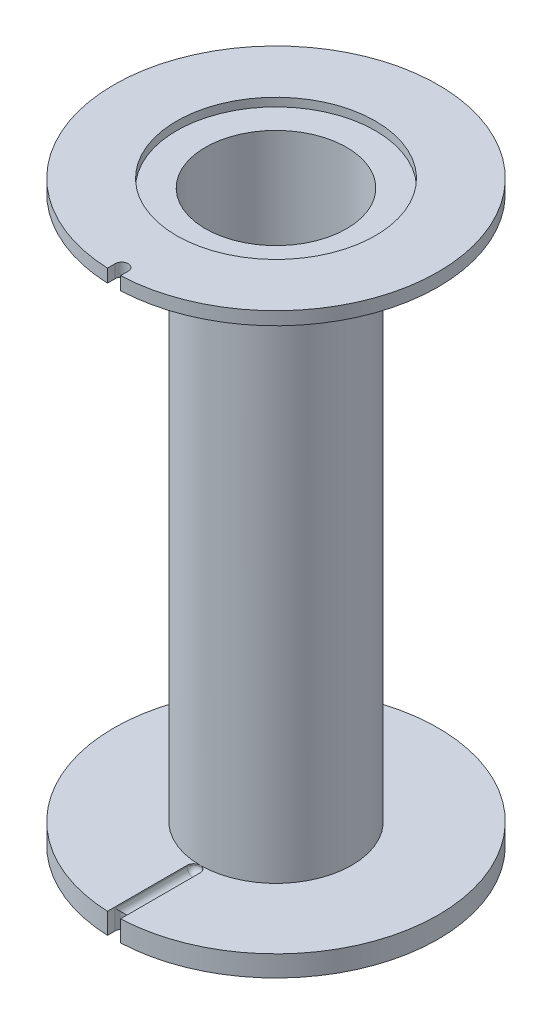
ISO-10303-21;
HEADER;
FILE_DESCRIPTION(('STEP AP214'),'2;1');
FILE_NAME('part.step','',(''),(''),'','','');
FILE_SCHEMA(('AUTOMOTIVE_DESIGN { 1 0 10303 214 1 1 1 1 }'));
ENDSEC;
DATA;
#1=APPLICATION_CONTEXT('core data for automotive mechanical design processes');
#2=APPLICATION_PROTOCOL_DEFINITION('international standard','automotive_design',2000,#1);
#3=PRODUCT_CONTEXT('',#1,'mechanical');
#4=PRODUCT('Part','Part','',(#3));
#5=PRODUCT_RELATED_PRODUCT_CATEGORY('part','',(#4));
#6=PRODUCT_DEFINITION_FORMATION('','',#4);
#7=PRODUCT_DEFINITION_CONTEXT('part definition',#1,'design');
#8=PRODUCT_DEFINITION('design','',#6,#7);
#9=PRODUCT_DEFINITION_SHAPE('','',#8);
#10=(LENGTH_UNIT() NAMED_UNIT(*) SI_UNIT(.MILLI.,.METRE.));
#11=(NAMED_UNIT(*) PLANE_ANGLE_UNIT() SI_UNIT($,.RADIAN.));
#12=(NAMED_UNIT(*) SI_UNIT($,.STERADIAN.) SOLID_ANGLE_UNIT());
#13=UNCERTAINTY_MEASURE_WITH_UNIT(LENGTH_MEASURE(1.E-05),#10,'distance_accuracy_value','');
#14=(GEOMETRIC_REPRESENTATION_CONTEXT(3) GLOBAL_UNCERTAINTY_ASSIGNED_CONTEXT((#13)) GLOBAL_UNIT_ASSIGNED_CONTEXT((#10,
#11,#12)) REPRESENTATION_CONTEXT('',''));
#15=CARTESIAN_POINT('',(0.,0.,0.));
#16=DIRECTION('',(0.,0.,1.));
#17=DIRECTION('',(1.,0.,0.));
#18=AXIS2_PLACEMENT_3D('',#15,#16,#17);
#19=CARTESIAN_POINT('',(-11.5159821298024,87.1751153655197,0.));
#20=DIRECTION('',(0.,-1.,0.));
#21=DIRECTION('',(1.,0.,0.));
#22=AXIS2_PLACEMENT_3D('',#19,#20,#21);
#23=CYLINDRICAL_SURFACE('',#22,13.4999999999999);
#24=CARTESIAN_POINT('',(-11.5159821298024,33.5251153655198,0.));
#25=DIRECTION('',(0.,-1.,0.));
#26=DIRECTION('',(1.,0.,0.));
#27=AXIS2_PLACEMENT_3D('',#24,#25,#26);
#28=CIRCLE('',#27,13.4999999999999);
#29=CARTESIAN_POINT('',(1.98401787019748,33.5251153655198,0.));
#30=VERTEX_POINT('',#29);
#31=EDGE_CURVE('E20',#30,#30,#28,.T.);
#32=ORIENTED_EDGE('',*,*,#31,.T.);
#33=EDGE_LOOP('',(#32));
#34=FACE_BOUND('',#33,.T.);
#35=CARTESIAN_POINT('',(-11.5159821298024,140.82511536552,0.));
#36=DIRECTION('',(0.,-1.,0.));
#37=DIRECTION('',(1.,0.,0.));
#38=AXIS2_PLACEMENT_3D('',#35,#36,#37);
#39=CIRCLE('',#38,13.4999999999999);
#40=CARTESIAN_POINT('',(1.98401787019747,140.82511536552,0.));
#41=VERTEX_POINT('',#40);
#42=EDGE_CURVE('E350',#41,#41,#39,.F.);
#43=ORIENTED_EDGE('',*,*,#42,.T.);
#44=EDGE_LOOP('',(#43));
#45=FACE_BOUND('',#44,.T.);
#46=ADVANCED_FACE('F17',(#34,#45),#23,.F.);
#47=CARTESIAN_POINT('',(-11.5159821298024,33.5251153655198,0.));
#48=DIRECTION('',(0.,1.,0.));
#49=DIRECTION('',(0.,0.,1.));
#50=AXIS2_PLACEMENT_3D('',#47,#48,#49);
#51=PLANE('',#50);
#52=ORIENTED_EDGE('',*,*,#31,.F.);
#53=EDGE_LOOP('',(#52));
#54=FACE_BOUND('',#53,.T.);
#55=CARTESIAN_POINT('',(-11.5159821298024,33.5251153655198,0.));
#56=DIRECTION('',(0.,1.,0.));
#57=DIRECTION('',(0.,0.,1.));
#58=AXIS2_PLACEMENT_3D('',#55,#56,#57);
#59=CIRCLE('',#58,19.);
#60=CARTESIAN_POINT('',(-11.5159821298024,33.5251153655198,19.));
#61=VERTEX_POINT('',#60);
#62=EDGE_CURVE('E347',#61,#61,#59,.F.);
#63=ORIENTED_EDGE('',*,*,#62,.T.);
#64=EDGE_LOOP('',(#63));
#65=FACE_BOUND('',#64,.T.);
#66=ADVANCED_FACE('F128',(#54,#65),#51,.F.);
#67=CARTESIAN_POINT('',(-11.5159821298024,140.82511536552,0.));
#68=DIRECTION('',(0.,-1.,0.));
#69=DIRECTION('',(0.,0.,-1.));
#70=AXIS2_PLACEMENT_3D('',#67,#68,#69);
#71=PLANE('',#70);
#72=ORIENTED_EDGE('',*,*,#42,.F.);
#73=EDGE_LOOP('',(#72));
#74=FACE_BOUND('',#73,.T.);
#75=CARTESIAN_POINT('',(-11.5159821298024,140.82511536552,0.));
#76=DIRECTION('',(0.,-1.,0.));
#77=DIRECTION('',(0.,0.,-1.));
#78=AXIS2_PLACEMENT_3D('',#75,#76,#77);
#79=CIRCLE('',#78,19.);
#80=CARTESIAN_POINT('',(-11.5159821298024,140.82511536552,-19.));
#81=VERTEX_POINT('',#80);
#82=EDGE_CURVE('E343',#81,#81,#79,.F.);
#83=ORIENTED_EDGE('',*,*,#82,.T.);
#84=EDGE_LOOP('',(#83));
#85=FACE_BOUND('',#84,.T.);
#86=ADVANCED_FACE('F125',(#74,#85),#71,.F.);
#87=CARTESIAN_POINT('',(-11.5159821298024,31.9251153655198,0.));
#88=DIRECTION('',(0.,1.,0.));
#89=DIRECTION('',(0.,0.,1.));
#90=AXIS2_PLACEMENT_3D('',#87,#88,#89);
#91=CYLINDRICAL_SURFACE('',#90,19.);
#92=CARTESIAN_POINT('',(-11.5159821298024,31.9251153655198,0.));
#93=DIRECTION('',(0.,1.,0.));
#94=DIRECTION('',(0.,0.,1.));
#95=AXIS2_PLACEMENT_3D('',#92,#93,#94);
#96=CIRCLE('',#95,19.);
#97=CARTESIAN_POINT('',(-11.5159821298024,31.9251153655198,19.));
#98=VERTEX_POINT('',#97);
#99=EDGE_CURVE('E291',#98,#98,#96,.T.);
#100=ORIENTED_EDGE('',*,*,#99,.F.);
#101=EDGE_LOOP('',(#100));
#102=FACE_BOUND('',#101,.T.);
#103=ORIENTED_EDGE('',*,*,#62,.F.);
#104=EDGE_LOOP('',(#103));
#105=FACE_BOUND('',#104,.T.);
#106=ADVANCED_FACE('F121',(#102,#105),#91,.F.);
#107=CARTESIAN_POINT('',(-11.5159821298024,142.42511536552,0.));
#108=DIRECTION('',(0.,-1.,0.));
#109=DIRECTION('',(0.,0.,-1.));
#110=AXIS2_PLACEMENT_3D('',#107,#108,#109);
#111=CYLINDRICAL_SURFACE('',#110,19.);
#112=CARTESIAN_POINT('',(-11.5159821298024,142.42511536552,0.));
#113=DIRECTION('',(0.,-1.,0.));
#114=DIRECTION('',(0.,0.,-1.));
#115=AXIS2_PLACEMENT_3D('',#112,#113,#114);
#116=CIRCLE('',#115,19.);
#117=CARTESIAN_POINT('',(-11.5159821298024,142.42511536552,-19.));
#118=VERTEX_POINT('',#117);
#119=EDGE_CURVE('E331',#118,#118,#116,.T.);
#120=ORIENTED_EDGE('',*,*,#119,.F.);
#121=EDGE_LOOP('',(#120));
#122=FACE_BOUND('',#121,.T.);
#123=ORIENTED_EDGE('',*,*,#82,.F.);
#124=EDGE_LOOP('',(#123));
#125=FACE_BOUND('',#124,.T.);
#126=ADVANCED_FACE('F117',(#122,#125),#111,.F.);
#127=CARTESIAN_POINT('',(-11.5159821298024,35.6751153655198,15.75));
#128=DIRECTION('',(-0.707106781186548,0.,0.707106781186548));
#129=DIRECTION('',(0.408248290463863,-0.816496580927726,0.408248290463863));
#130=AXIS2_PLACEMENT_3D('',#127,#128,#129);
#131=SPHERICAL_SURFACE('',#130,1.25);
#132=CARTESIAN_POINT('',(-11.5159821298024,35.6751153655198,15.75));
#133=DIRECTION('',(0.,-1.,0.));
#134=DIRECTION('',(0.,0.,-1.));
#135=AXIS2_PLACEMENT_3D('',#132,#133,#134);
#136=CIRCLE('',#135,1.25);
#137=CARTESIAN_POINT('',(-10.6320986533193,35.6751153655198,14.8661165235168));
#138=VERTEX_POINT('',#137);
#139=CARTESIAN_POINT('',(-12.7659821298024,35.6751153655198,15.75));
#140=VERTEX_POINT('',#139);
#141=EDGE_CURVE('E328',#138,#140,#136,.F.);
#142=ORIENTED_EDGE('',*,*,#141,.T.);
#143=CARTESIAN_POINT('',(-11.5159821298024,35.6751153655198,15.75));
#144=DIRECTION('',(0.,0.,-1.));
#145=DIRECTION('',(-1.,0.,0.));
#146=AXIS2_PLACEMENT_3D('',#143,#144,#145);
#147=CIRCLE('',#146,1.25);
#148=CARTESIAN_POINT('',(-10.2659821298025,35.675115365518,15.75));
#149=VERTEX_POINT('',#148);
#150=EDGE_CURVE('E93',#140,#149,#147,.F.);
#151=ORIENTED_EDGE('',*,*,#150,.T.);
#152=CARTESIAN_POINT('',(-11.5159821298025,35.6751153655198,15.75));
#153=DIRECTION('',(2.80128698015858E-12,1.,2.80131473573419E-12));
#154=DIRECTION('',(-0.707106781186547,0.,0.707106781186547));
#155=AXIS2_PLACEMENT_3D('',#152,#153,#154);
#156=CIRCLE('',#155,1.25);
#157=EDGE_CURVE('E39',#138,#149,#156,.F.);
#158=ORIENTED_EDGE('',*,*,#157,.F.);
#159=EDGE_LOOP('',(#142,#151,#158));
#160=FACE_BOUND('',#159,.T.);
#161=ADVANCED_FACE('F113',(#160),#131,.F.);
#162=CARTESIAN_POINT('',(-11.5159821298024,31.9251153655198,29.5));
#163=DIRECTION('',(0.,1.,0.));
#164=DIRECTION('',(-1.,0.,0.));
#165=AXIS2_PLACEMENT_3D('',#162,#163,#164);
#166=CYLINDRICAL_SURFACE('',#165,1.25);
#167=DIRECTION('',(0.,1.,0.));
#168=VECTOR('',#167,1.);
#169=CARTESIAN_POINT('',(-12.7659821298024,37.1873402785639,29.5));
#170=LINE('',#169,#168);
#171=CARTESIAN_POINT('',(-12.7659821298024,35.6751153655198,29.5));
#172=VERTEX_POINT('',#171);
#173=CARTESIAN_POINT('',(-12.7659821298024,31.9251153655198,29.5));
#174=VERTEX_POINT('',#173);
#175=EDGE_CURVE('E304',#172,#174,#170,.F.);
#176=ORIENTED_EDGE('',*,*,#175,.T.);
#177=CARTESIAN_POINT('',(-11.5159821298024,31.9251153655198,29.5));
#178=DIRECTION('',(0.,1.,0.));
#179=DIRECTION('',(-1.,0.,0.));
#180=AXIS2_PLACEMENT_3D('',#177,#178,#179);
#181=CIRCLE('',#180,1.25);
#182=CARTESIAN_POINT('',(-10.2659821298025,31.9251153655198,29.5));
#183=VERTEX_POINT('',#182);
#184=EDGE_CURVE('E76',#183,#174,#181,.T.);
#185=ORIENTED_EDGE('',*,*,#184,.F.);
#186=DIRECTION('',(0.,1.,0.));
#187=VECTOR('',#186,1.);
#188=CARTESIAN_POINT('',(-10.2659821298025,35.6751153655198,29.5));
#189=LINE('',#188,#187);
#190=CARTESIAN_POINT('',(-10.2659821298025,35.6751153655198,29.5));
#191=VERTEX_POINT('',#190);
#192=EDGE_CURVE('E70',#183,#191,#189,.T.);
#193=ORIENTED_EDGE('',*,*,#192,.T.);
#194=CARTESIAN_POINT('',(-11.5159821298024,35.6751153655198,29.5));
#195=DIRECTION('',(0.,0.707106781186547,-0.707106781186547));
#196=DIRECTION('',(0.,0.707106781186547,0.707106781186547));
#197=AXIS2_PLACEMENT_3D('',#194,#195,#196);
#198=ELLIPSE('',#197,1.76776695296637,1.25);
#199=EDGE_CURVE('E73',#191,#172,#198,.T.);
#200=ORIENTED_EDGE('',*,*,#199,.T.);
#201=EDGE_LOOP('',(#176,#185,#193,#200));
#202=FACE_BOUND('',#201,.T.);
#203=ADVANCED_FACE('F72',(#202),#166,.F.);
#204=CARTESIAN_POINT('',(-11.5159821298024,35.6751153655198,31.));
#205=DIRECTION('',(0.,0.,-1.));
#206=DIRECTION('',(-1.,0.,0.));
#207=AXIS2_PLACEMENT_3D('',#204,#205,#206);
#208=CYLINDRICAL_SURFACE('',#207,1.25);
#209=DIRECTION('',(0.,0.,1.));
#210=VECTOR('',#209,1.);
#211=CARTESIAN_POINT('',(-12.7659821298024,35.6751153655198,31.));
#212=LINE('',#211,#210);
#213=EDGE_CURVE('E90',#140,#172,#212,.T.);
#214=ORIENTED_EDGE('',*,*,#213,.T.);
#215=ORIENTED_EDGE('',*,*,#199,.F.);
#216=DIRECTION('',(0.,0.,-1.));
#217=VECTOR('',#216,1.);
#218=CARTESIAN_POINT('',(-10.2659821298025,35.6751153655198,31.));
#219=LINE('',#218,#217);
#220=EDGE_CURVE('E82',#191,#149,#219,.T.);
#221=ORIENTED_EDGE('',*,*,#220,.T.);
#222=ORIENTED_EDGE('',*,*,#150,.F.);
#223=EDGE_LOOP('',(#214,#215,#221,#222));
#224=FACE_BOUND('',#223,.T.);
#225=ADVANCED_FACE('F87',(#224),#208,.F.);
#226=CARTESIAN_POINT('',(10.7340178701975,31.9251153655198,0.));
#227=DIRECTION('',(0.,-1.,0.));
#228=DIRECTION('',(0.,0.,-1.));
#229=AXIS2_PLACEMENT_3D('',#226,#227,#228);
#230=PLANE('',#229);
#231=ORIENTED_EDGE('',*,*,#99,.T.);
#232=EDGE_LOOP('',(#231));
#233=FACE_BOUND('',#232,.T.);
#234=DIRECTION('',(0.,0.,1.));
#235=VECTOR('',#234,1.);
#236=CARTESIAN_POINT('',(-12.7659821298024,31.9251153655198,31.));
#237=LINE('',#236,#235);
#238=CARTESIAN_POINT('',(-12.7659821298024,31.9251153655198,30.9747881348686));
#239=VERTEX_POINT('',#238);
#240=EDGE_CURVE('E295',#174,#239,#237,.T.);
#241=ORIENTED_EDGE('',*,*,#240,.T.);
#242=CARTESIAN_POINT('',(-11.5159821298024,31.9251153655198,0.));
#243=DIRECTION('',(0.,-1.,0.));
#244=DIRECTION('',(1.,0.,0.));
#245=AXIS2_PLACEMENT_3D('',#242,#243,#244);
#246=CIRCLE('',#245,31.);
#247=CARTESIAN_POINT('',(-10.2659821298025,31.9251153655198,30.9747881348686));
#248=VERTEX_POINT('',#247);
#249=EDGE_CURVE('E298',#248,#239,#246,.F.);
#250=ORIENTED_EDGE('',*,*,#249,.F.);
#251=DIRECTION('',(0.,0.,-1.));
#252=VECTOR('',#251,1.);
#253=CARTESIAN_POINT('',(-10.2659821298025,31.9251153655198,31.));
#254=LINE('',#253,#252);
#255=EDGE_CURVE('E83',#248,#183,#254,.T.);
#256=ORIENTED_EDGE('',*,*,#255,.T.);
#257=ORIENTED_EDGE('',*,*,#184,.T.);
#258=EDGE_LOOP('',(#241,#250,#256,#257));
#259=FACE_BOUND('',#258,.T.);
#260=ADVANCED_FACE('F186',(#233,#259),#230,.T.);
#261=CARTESIAN_POINT('',(-10.2659821298024,31.9251153655198,29.5));
#262=DIRECTION('',(1.,0.,0.));
#263=DIRECTION('',(0.,0.,-1.));
#264=AXIS2_PLACEMENT_3D('',#261,#262,#263);
#265=PLANE('',#264);
#266=DIRECTION('',(0.,1.,0.));
#267=VECTOR('',#266,1.);
#268=CARTESIAN_POINT('',(-10.2659821298024,31.9251153655198,29.5));
#269=LINE('',#268,#267);
#270=CARTESIAN_POINT('',(-10.2659821298024,142.42511536552,29.5));
#271=VERTEX_POINT('',#270);
#272=CARTESIAN_POINT('',(-10.2659821298024,139.92511536552,29.5));
#273=VERTEX_POINT('',#272);
#274=EDGE_CURVE('E315',#271,#273,#269,.F.);
#275=ORIENTED_EDGE('',*,*,#274,.T.);
#276=DIRECTION('',(0.,0.,-1.));
#277=VECTOR('',#276,1.);
#278=CARTESIAN_POINT('',(-10.2659821298024,139.92511536552,29.5));
#279=LINE('',#278,#277);
#280=CARTESIAN_POINT('',(-10.2659821298024,139.92511536552,30.9747881348686));
#281=VERTEX_POINT('',#280);
#282=EDGE_CURVE('E338',#281,#273,#279,.T.);
#283=ORIENTED_EDGE('',*,*,#282,.F.);
#284=DIRECTION('',(0.,-1.,0.));
#285=VECTOR('',#284,1.);
#286=CARTESIAN_POINT('',(-10.2659821298024,141.17511536552,30.9747881348686));
#287=LINE('',#286,#285);
#288=CARTESIAN_POINT('',(-10.2659821298024,142.42511536552,30.9747881348686));
#289=VERTEX_POINT('',#288);
#290=EDGE_CURVE('E422',#289,#281,#287,.T.);
#291=ORIENTED_EDGE('',*,*,#290,.F.);
#292=DIRECTION('',(0.,0.,1.));
#293=VECTOR('',#292,1.);
#294=CARTESIAN_POINT('',(-10.2659821298024,142.42511536552,0.));
#295=LINE('',#294,#293);
#296=EDGE_CURVE('E435',#271,#289,#295,.T.);
#297=ORIENTED_EDGE('',*,*,#296,.F.);
#298=EDGE_LOOP('',(#275,#283,#291,#297));
#299=FACE_BOUND('',#298,.T.);
#300=ADVANCED_FACE('F182',(#299),#265,.F.);
#301=CARTESIAN_POINT('',(-12.7659821298024,31.9251153655198,32.7463376433633));
#302=DIRECTION('',(-1.,0.,0.));
#303=DIRECTION('',(0.,0.,1.));
#304=AXIS2_PLACEMENT_3D('',#301,#302,#303);
#305=PLANE('',#304);
#306=DIRECTION('',(0.,-1.,0.));
#307=VECTOR('',#306,1.);
#308=CARTESIAN_POINT('',(-12.7659821298024,141.17511536552,30.9747881348686));
#309=LINE('',#308,#307);
#310=CARTESIAN_POINT('',(-12.7659821298024,139.92511536552,30.9747881348686));
#311=VERTEX_POINT('',#310);
#312=CARTESIAN_POINT('',(-12.7659821298024,142.42511536552,30.9747881348686));
#313=VERTEX_POINT('',#312);
#314=EDGE_CURVE('E375',#311,#313,#309,.F.);
#315=ORIENTED_EDGE('',*,*,#314,.F.);
#316=DIRECTION('',(0.,0.,1.));
#317=VECTOR('',#316,1.);
#318=CARTESIAN_POINT('',(-12.7659821298024,139.92511536552,32.7463376433633));
#319=LINE('',#318,#317);
#320=CARTESIAN_POINT('',(-12.7659821298024,139.92511536552,29.5));
#321=VERTEX_POINT('',#320);
#322=EDGE_CURVE('E427',#321,#311,#319,.T.);
#323=ORIENTED_EDGE('',*,*,#322,.F.);
#324=DIRECTION('',(0.,1.,0.));
#325=VECTOR('',#324,1.);
#326=CARTESIAN_POINT('',(-12.7659821298024,31.9251153655198,29.5));
#327=LINE('',#326,#325);
#328=CARTESIAN_POINT('',(-12.7659821298024,142.42511536552,29.5));
#329=VERTEX_POINT('',#328);
#330=EDGE_CURVE('E441',#321,#329,#327,.T.);
#331=ORIENTED_EDGE('',*,*,#330,.T.);
#332=DIRECTION('',(0.,0.,1.));
#333=VECTOR('',#332,1.);
#334=CARTESIAN_POINT('',(-12.7659821298024,142.42511536552,0.));
#335=LINE('',#334,#333);
#336=EDGE_CURVE('E335',#313,#329,#335,.F.);
#337=ORIENTED_EDGE('',*,*,#336,.F.);
#338=EDGE_LOOP('',(#315,#323,#331,#337));
#339=FACE_BOUND('',#338,.T.);
#340=ADVANCED_FACE('F178',(#339),#305,.F.);
#341=CARTESIAN_POINT('',(10.7340178701975,142.42511536552,0.));
#342=DIRECTION('',(0.,1.,0.));
#343=DIRECTION('',(0.,0.,1.));
#344=AXIS2_PLACEMENT_3D('',#341,#342,#343);
#345=PLANE('',#344);
#346=ORIENTED_EDGE('',*,*,#119,.T.);
#347=EDGE_LOOP('',(#346));
#348=FACE_BOUND('',#347,.T.);
#349=ORIENTED_EDGE('',*,*,#336,.T.);
#350=CARTESIAN_POINT('',(-11.5159821298024,142.42511536552,29.5));
#351=DIRECTION('',(0.,1.,0.));
#352=DIRECTION('',(-1.,0.,0.));
#353=AXIS2_PLACEMENT_3D('',#350,#351,#352);
#354=CIRCLE('',#353,1.25);
#355=EDGE_CURVE('E326',#329,#271,#354,.F.);
#356=ORIENTED_EDGE('',*,*,#355,.T.);
#357=ORIENTED_EDGE('',*,*,#296,.T.);
#358=CARTESIAN_POINT('',(-11.5159821298024,142.42511536552,0.));
#359=DIRECTION('',(0.,-1.,0.));
#360=DIRECTION('',(1.,0.,0.));
#361=AXIS2_PLACEMENT_3D('',#358,#359,#360);
#362=CIRCLE('',#361,31.);
#363=EDGE_CURVE('E369',#313,#289,#362,.T.);
#364=ORIENTED_EDGE('',*,*,#363,.F.);
#365=EDGE_LOOP('',(#349,#356,#357,#364));
#366=FACE_BOUND('',#365,.T.);
#367=ADVANCED_FACE('F174',(#348,#366),#345,.T.);
#368=CARTESIAN_POINT('',(-12.7659821298024,37.1873402785639,31.));
#369=DIRECTION('',(-1.,0.,0.));
#370=DIRECTION('',(0.,0.,1.));
#371=AXIS2_PLACEMENT_3D('',#368,#369,#370);
#372=PLANE('',#371);
#373=DIRECTION('',(0.,0.,1.));
#374=VECTOR('',#373,1.);
#375=CARTESIAN_POINT('',(-12.7659821298024,35.9251153655198,0.));
#376=LINE('',#375,#374);
#377=CARTESIAN_POINT('',(-12.7659821298024,35.9251153655198,30.9747881348686));
#378=VERTEX_POINT('',#377);
#379=CARTESIAN_POINT('',(-12.7659821298024,35.9251153655198,15.75));
#380=VERTEX_POINT('',#379);
#381=EDGE_CURVE('E311',#378,#380,#376,.F.);
#382=ORIENTED_EDGE('',*,*,#381,.F.);
#383=DIRECTION('',(0.,-1.,0.));
#384=VECTOR('',#383,1.);
#385=CARTESIAN_POINT('',(-12.7659821298024,33.9251153655198,30.9747881348686));
#386=LINE('',#385,#384);
#387=EDGE_CURVE('E307',#239,#378,#386,.F.);
#388=ORIENTED_EDGE('',*,*,#387,.F.);
#389=ORIENTED_EDGE('',*,*,#240,.F.);
#390=ORIENTED_EDGE('',*,*,#175,.F.);
#391=ORIENTED_EDGE('',*,*,#213,.F.);
#392=DIRECTION('',(0.,-1.,0.));
#393=VECTOR('',#392,1.);
#394=CARTESIAN_POINT('',(-12.7659821298024,36.9012562457839,15.75));
#395=LINE('',#394,#393);
#396=EDGE_CURVE('E303',#140,#380,#395,.F.);
#397=ORIENTED_EDGE('',*,*,#396,.T.);
#398=EDGE_LOOP('',(#382,#388,#389,#390,#391,#397));
#399=FACE_BOUND('',#398,.T.);
#400=ADVANCED_FACE('F170',(#399),#372,.F.);
#401=CARTESIAN_POINT('',(-11.5159821298024,36.9012562457839,15.75));
#402=DIRECTION('',(0.,-1.,0.));
#403=DIRECTION('',(0.,0.,-1.));
#404=AXIS2_PLACEMENT_3D('',#401,#402,#403);
#405=CYLINDRICAL_SURFACE('',#404,1.25);
#406=DIRECTION('',(0.,1.,0.));
#407=VECTOR('',#406,1.);
#408=CARTESIAN_POINT('',(-10.2659821298025,35.6751153655198,15.75));
#409=LINE('',#408,#407);
#410=CARTESIAN_POINT('',(-10.2659821298025,35.9251153655198,15.75));
#411=VERTEX_POINT('',#410);
#412=EDGE_CURVE('E98',#149,#411,#409,.T.);
#413=ORIENTED_EDGE('',*,*,#412,.T.);
#414=CARTESIAN_POINT('',(-11.5159821298024,35.9251153655198,15.75));
#415=DIRECTION('',(0.,-1.,0.));
#416=DIRECTION('',(0.,0.,-1.));
#417=AXIS2_PLACEMENT_3D('',#414,#415,#416);
#418=CIRCLE('',#417,1.25);
#419=EDGE_CURVE('E360',#380,#411,#418,.T.);
#420=ORIENTED_EDGE('',*,*,#419,.F.);
#421=ORIENTED_EDGE('',*,*,#396,.F.);
#422=ORIENTED_EDGE('',*,*,#141,.F.);
#423=ORIENTED_EDGE('',*,*,#157,.T.);
#424=EDGE_LOOP('',(#413,#420,#421,#422,#423));
#425=FACE_BOUND('',#424,.T.);
#426=ADVANCED_FACE('F167',(#425),#405,.F.);
#427=CARTESIAN_POINT('',(-10.2659821298025,35.6751153655198,31.));
#428=DIRECTION('',(1.,0.,0.));
#429=DIRECTION('',(0.,0.,-1.));
#430=AXIS2_PLACEMENT_3D('',#427,#428,#429);
#431=PLANE('',#430);
#432=ORIENTED_EDGE('',*,*,#220,.F.);
#433=ORIENTED_EDGE('',*,*,#192,.F.);
#434=ORIENTED_EDGE('',*,*,#255,.F.);
#435=DIRECTION('',(0.,-1.,0.));
#436=VECTOR('',#435,1.);
#437=CARTESIAN_POINT('',(-10.2659821298025,33.9251153655198,30.9747881348686));
#438=LINE('',#437,#436);
#439=CARTESIAN_POINT('',(-10.2659821298025,35.9251153655198,30.9747881348686));
#440=VERTEX_POINT('',#439);
#441=EDGE_CURVE('E104',#440,#248,#438,.T.);
#442=ORIENTED_EDGE('',*,*,#441,.F.);
#443=DIRECTION('',(0.,0.,1.));
#444=VECTOR('',#443,1.);
#445=CARTESIAN_POINT('',(-10.2659821298025,35.9251153655198,0.));
#446=LINE('',#445,#444);
#447=EDGE_CURVE('E362',#411,#440,#446,.T.);
#448=ORIENTED_EDGE('',*,*,#447,.F.);
#449=ORIENTED_EDGE('',*,*,#412,.F.);
#450=EDGE_LOOP('',(#432,#433,#434,#442,#448,#449));
#451=FACE_BOUND('',#450,.T.);
#452=ADVANCED_FACE('F95',(#451),#431,.F.);
#453=CARTESIAN_POINT('',(-11.5159821298024,33.9251153655198,0.));
#454=DIRECTION('',(0.,-1.,0.));
#455=DIRECTION('',(1.,0.,0.));
#456=AXIS2_PLACEMENT_3D('',#453,#454,#455);
#457=CYLINDRICAL_SURFACE('',#456,31.);
#458=ORIENTED_EDGE('',*,*,#387,.T.);
#459=CARTESIAN_POINT('',(-11.5159821298024,35.9251153655198,0.));
#460=DIRECTION('',(0.,-1.,0.));
#461=DIRECTION('',(1.,0.,0.));
#462=AXIS2_PLACEMENT_3D('',#459,#460,#461);
#463=CIRCLE('',#462,31.);
#464=EDGE_CURVE('E367',#440,#378,#463,.F.);
#465=ORIENTED_EDGE('',*,*,#464,.F.);
#466=ORIENTED_EDGE('',*,*,#441,.T.);
#467=ORIENTED_EDGE('',*,*,#249,.T.);
#468=EDGE_LOOP('',(#458,#465,#466,#467));
#469=FACE_BOUND('',#468,.T.);
#470=ADVANCED_FACE('F160',(#469),#457,.T.);
#471=CARTESIAN_POINT('',(-11.5159821298024,31.9251153655198,29.5));
#472=DIRECTION('',(0.,1.,0.));
#473=DIRECTION('',(-1.,0.,0.));
#474=AXIS2_PLACEMENT_3D('',#471,#472,#473);
#475=CYLINDRICAL_SURFACE('',#474,1.25);
#476=ORIENTED_EDGE('',*,*,#330,.F.);
#477=CARTESIAN_POINT('',(-11.5159821298024,139.92511536552,29.5));
#478=DIRECTION('',(0.,1.,0.));
#479=DIRECTION('',(-1.,0.,0.));
#480=AXIS2_PLACEMENT_3D('',#477,#478,#479);
#481=CIRCLE('',#480,1.25);
#482=EDGE_CURVE('E378',#273,#321,#481,.T.);
#483=ORIENTED_EDGE('',*,*,#482,.F.);
#484=ORIENTED_EDGE('',*,*,#274,.F.);
#485=ORIENTED_EDGE('',*,*,#355,.F.);
#486=EDGE_LOOP('',(#476,#483,#484,#485));
#487=FACE_BOUND('',#486,.T.);
#488=ADVANCED_FACE('F156',(#487),#475,.F.);
#489=CARTESIAN_POINT('',(-11.5159821298024,141.17511536552,0.));
#490=DIRECTION('',(0.,-1.,0.));
#491=DIRECTION('',(1.,0.,0.));
#492=AXIS2_PLACEMENT_3D('',#489,#490,#491);
#493=CYLINDRICAL_SURFACE('',#492,31.);
#494=ORIENTED_EDGE('',*,*,#314,.T.);
#495=ORIENTED_EDGE('',*,*,#363,.T.);
#496=ORIENTED_EDGE('',*,*,#290,.T.);
#497=CARTESIAN_POINT('',(-11.5159821298024,139.92511536552,0.));
#498=DIRECTION('',(0.,-1.,0.));
#499=DIRECTION('',(1.,0.,0.));
#500=AXIS2_PLACEMENT_3D('',#497,#498,#499);
#501=CIRCLE('',#500,31.);
#502=EDGE_CURVE('E381',#311,#281,#501,.T.);
#503=ORIENTED_EDGE('',*,*,#502,.F.);
#504=EDGE_LOOP('',(#494,#495,#496,#503));
#505=FACE_BOUND('',#504,.T.);
#506=ADVANCED_FACE('F152',(#505),#493,.T.);
#507=CARTESIAN_POINT('',(11.2340178701975,35.9251153655198,0.));
#508=DIRECTION('',(0.,1.,0.));
#509=DIRECTION('',(0.,0.,1.));
#510=AXIS2_PLACEMENT_3D('',#507,#508,#509);
#511=PLANE('',#510);
#512=CARTESIAN_POINT('',(-11.5159821298024,35.9251153655198,0.));
#513=DIRECTION('',(0.,-1.,0.));
#514=DIRECTION('',(1.,0.,0.));
#515=AXIS2_PLACEMENT_3D('',#512,#513,#514);
#516=CIRCLE('',#515,14.5);
#517=CARTESIAN_POINT('',(2.98401787019755,35.9251153655198,0.));
#518=VERTEX_POINT('',#517);
#519=EDGE_CURVE('E27',#518,#518,#516,.F.);
#520=ORIENTED_EDGE('',*,*,#519,.F.);
#521=EDGE_LOOP('',(#520));
#522=FACE_BOUND('',#521,.T.);
#523=ORIENTED_EDGE('',*,*,#447,.T.);
#524=ORIENTED_EDGE('',*,*,#464,.T.);
#525=ORIENTED_EDGE('',*,*,#381,.T.);
#526=ORIENTED_EDGE('',*,*,#419,.T.);
#527=EDGE_LOOP('',(#523,#524,#525,#526));
#528=FACE_BOUND('',#527,.T.);
#529=ADVANCED_FACE('F146',(#522,#528),#511,.T.);
#530=CARTESIAN_POINT('',(11.2340178701975,139.92511536552,0.));
#531=DIRECTION('',(0.,-1.,0.));
#532=DIRECTION('',(0.,0.,-1.));
#533=AXIS2_PLACEMENT_3D('',#530,#531,#532);
#534=PLANE('',#533);
#535=CARTESIAN_POINT('',(-11.5159821298024,139.92511536552,0.));
#536=DIRECTION('',(0.,-1.,0.));
#537=DIRECTION('',(1.,0.,0.));
#538=AXIS2_PLACEMENT_3D('',#535,#536,#537);
#539=CIRCLE('',#538,14.5);
#540=CARTESIAN_POINT('',(2.98401787019753,139.92511536552,0.));
#541=VERTEX_POINT('',#540);
#542=EDGE_CURVE('E11',#541,#541,#539,.T.);
#543=ORIENTED_EDGE('',*,*,#542,.F.);
#544=EDGE_LOOP('',(#543));
#545=FACE_BOUND('',#544,.T.);
#546=ORIENTED_EDGE('',*,*,#322,.T.);
#547=ORIENTED_EDGE('',*,*,#502,.T.);
#548=ORIENTED_EDGE('',*,*,#282,.T.);
#549=ORIENTED_EDGE('',*,*,#482,.T.);
#550=EDGE_LOOP('',(#546,#547,#548,#549));
#551=FACE_BOUND('',#550,.T.);
#552=ADVANCED_FACE('F140',(#545,#551),#534,.T.);
#553=CARTESIAN_POINT('',(-11.5159821298024,87.9251153655198,0.));
#554=DIRECTION('',(0.,-1.,0.));
#555=DIRECTION('',(1.,0.,0.));
#556=AXIS2_PLACEMENT_3D('',#553,#554,#555);
#557=CYLINDRICAL_SURFACE('',#556,14.5);
#558=ORIENTED_EDGE('',*,*,#542,.T.);
#559=EDGE_LOOP('',(#558));
#560=FACE_BOUND('',#559,.T.);
#561=ORIENTED_EDGE('',*,*,#519,.T.);
#562=EDGE_LOOP('',(#561));
#563=FACE_BOUND('',#562,.T.);
#564=ADVANCED_FACE('F138',(#560,#563),#557,.T.);
#565=CLOSED_SHELL('',(#46,#66,#86,#106,#126,#161,#203,#225,#260,#300,#340,#367,#400,#426,#452,
#470,#488,#506,#529,#552,#564));
#566=MANIFOLD_SOLID_BREP('B1',#565);
#567=ADVANCED_BREP_SHAPE_REPRESENTATION('',(#18,#566),#14);
#568=SHAPE_DEFINITION_REPRESENTATION(#9,#567);
ENDSEC;
END-ISO-10303-21;
